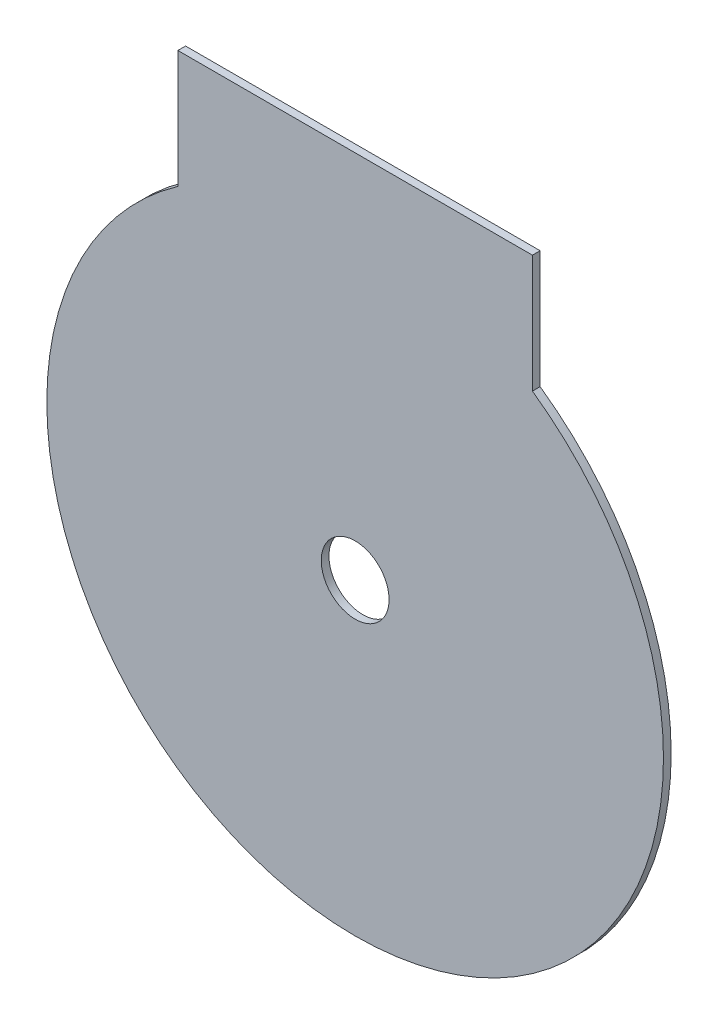
ISO-10303-21;
HEADER;
FILE_DESCRIPTION(('STEP AP214'),'2;1');
FILE_NAME('part.step','',(''),(''),'','','');
FILE_SCHEMA(('AUTOMOTIVE_DESIGN { 1 0 10303 214 1 1 1 1 }'));
ENDSEC;
DATA;
#1=APPLICATION_CONTEXT('core data for automotive mechanical design processes');
#2=APPLICATION_PROTOCOL_DEFINITION('international standard','automotive_design',2000,#1);
#3=PRODUCT_CONTEXT('',#1,'mechanical');
#4=PRODUCT('Part','Part','',(#3));
#5=PRODUCT_RELATED_PRODUCT_CATEGORY('part','',(#4));
#6=PRODUCT_DEFINITION_FORMATION('','',#4);
#7=PRODUCT_DEFINITION_CONTEXT('part definition',#1,'design');
#8=PRODUCT_DEFINITION('design','',#6,#7);
#9=PRODUCT_DEFINITION_SHAPE('','',#8);
#10=(LENGTH_UNIT() NAMED_UNIT(*) SI_UNIT(.MILLI.,.METRE.));
#11=(NAMED_UNIT(*) PLANE_ANGLE_UNIT() SI_UNIT($,.RADIAN.));
#12=(NAMED_UNIT(*) SI_UNIT($,.STERADIAN.) SOLID_ANGLE_UNIT());
#13=UNCERTAINTY_MEASURE_WITH_UNIT(LENGTH_MEASURE(1.E-05),#10,'distance_accuracy_value','');
#14=(GEOMETRIC_REPRESENTATION_CONTEXT(3) GLOBAL_UNCERTAINTY_ASSIGNED_CONTEXT((#13)) GLOBAL_UNIT_ASSIGNED_CONTEXT((#10,
#11,#12)) REPRESENTATION_CONTEXT('',''));
#15=CARTESIAN_POINT('',(0.,0.,0.));
#16=DIRECTION('',(0.,0.,1.));
#17=DIRECTION('',(1.,0.,0.));
#18=AXIS2_PLACEMENT_3D('',#15,#16,#17);
#19=CARTESIAN_POINT('',(0.,129.,2.5));
#20=DIRECTION('',(0.,0.,1.));
#21=DIRECTION('',(1.,0.,0.));
#22=AXIS2_PLACEMENT_3D('',#19,#20,#21);
#23=PLANE('',#22);
#24=DIRECTION('',(-1.,0.,0.));
#25=VECTOR('',#24,1.);
#26=CARTESIAN_POINT('',(57.5,249.,2.5));
#27=LINE('',#26,#25);
#28=CARTESIAN_POINT('',(57.5,249.,2.5));
#29=VERTEX_POINT('',#28);
#30=CARTESIAN_POINT('',(-57.5,249.,2.5));
#31=VERTEX_POINT('',#30);
#32=EDGE_CURVE('E84',#29,#31,#27,.T.);
#33=ORIENTED_EDGE('',*,*,#32,.T.);
#34=DIRECTION('',(0.,-1.,0.));
#35=VECTOR('',#34,1.);
#36=CARTESIAN_POINT('',(-57.5,249.,2.5));
#37=LINE('',#36,#35);
#38=CARTESIAN_POINT('',(-57.5,210.815340859768,2.5));
#39=VERTEX_POINT('',#38);
#40=EDGE_CURVE('E79',#31,#39,#37,.T.);
#41=ORIENTED_EDGE('',*,*,#40,.T.);
#42=CARTESIAN_POINT('',(0.,129.,2.5));
#43=DIRECTION('',(0.,0.,1.));
#44=DIRECTION('',(1.,0.,0.));
#45=AXIS2_PLACEMENT_3D('',#42,#43,#44);
#46=CIRCLE('',#45,100.);
#47=CARTESIAN_POINT('',(57.5,210.815340859768,2.5));
#48=VERTEX_POINT('',#47);
#49=EDGE_CURVE('E82',#39,#48,#46,.T.);
#50=ORIENTED_EDGE('',*,*,#49,.T.);
#51=DIRECTION('',(0.,1.,0.));
#52=VECTOR('',#51,1.);
#53=CARTESIAN_POINT('',(57.5,249.,2.5));
#54=LINE('',#53,#52);
#55=EDGE_CURVE('E49',#48,#29,#54,.T.);
#56=ORIENTED_EDGE('',*,*,#55,.T.);
#57=EDGE_LOOP('',(#33,#41,#50,#56));
#58=FACE_BOUND('',#57,.T.);
#59=CARTESIAN_POINT('',(0.,129.,2.5));
#60=DIRECTION('',(0.,0.,1.));
#61=DIRECTION('',(1.,0.,0.));
#62=AXIS2_PLACEMENT_3D('',#59,#60,#61);
#63=CIRCLE('',#62,11.);
#64=CARTESIAN_POINT('',(11.,129.,2.5));
#65=VERTEX_POINT('',#64);
#66=EDGE_CURVE('E99',#65,#65,#63,.T.);
#67=ORIENTED_EDGE('',*,*,#66,.F.);
#68=EDGE_LOOP('',(#67));
#69=FACE_BOUND('',#68,.T.);
#70=ADVANCED_FACE('F32',(#58,#69),#23,.T.);
#71=CARTESIAN_POINT('',(0.,129.,0.));
#72=DIRECTION('',(0.,0.,1.));
#73=DIRECTION('',(1.,0.,0.));
#74=AXIS2_PLACEMENT_3D('',#71,#72,#73);
#75=PLANE('',#74);
#76=DIRECTION('',(-1.,0.,0.));
#77=VECTOR('',#76,1.);
#78=CARTESIAN_POINT('',(57.5,249.,0.));
#79=LINE('',#78,#77);
#80=CARTESIAN_POINT('',(57.5,249.,0.));
#81=VERTEX_POINT('',#80);
#82=CARTESIAN_POINT('',(-57.5,249.,0.));
#83=VERTEX_POINT('',#82);
#84=EDGE_CURVE('E96',#81,#83,#79,.T.);
#85=ORIENTED_EDGE('',*,*,#84,.F.);
#86=DIRECTION('',(0.,1.,0.));
#87=VECTOR('',#86,1.);
#88=CARTESIAN_POINT('',(57.5,249.,0.));
#89=LINE('',#88,#87);
#90=CARTESIAN_POINT('',(57.5,210.815340859768,0.));
#91=VERTEX_POINT('',#90);
#92=EDGE_CURVE('E72',#91,#81,#89,.T.);
#93=ORIENTED_EDGE('',*,*,#92,.F.);
#94=CARTESIAN_POINT('',(0.,129.,0.));
#95=DIRECTION('',(0.,0.,1.));
#96=DIRECTION('',(1.,0.,0.));
#97=AXIS2_PLACEMENT_3D('',#94,#95,#96);
#98=CIRCLE('',#97,100.);
#99=CARTESIAN_POINT('',(-57.5,210.815340859768,0.));
#100=VERTEX_POINT('',#99);
#101=EDGE_CURVE('E66',#100,#91,#98,.T.);
#102=ORIENTED_EDGE('',*,*,#101,.F.);
#103=DIRECTION('',(0.,-1.,0.));
#104=VECTOR('',#103,1.);
#105=CARTESIAN_POINT('',(-57.5,249.,0.));
#106=LINE('',#105,#104);
#107=EDGE_CURVE('E88',#83,#100,#106,.T.);
#108=ORIENTED_EDGE('',*,*,#107,.F.);
#109=EDGE_LOOP('',(#85,#93,#102,#108));
#110=FACE_BOUND('',#109,.T.);
#111=CARTESIAN_POINT('',(0.,129.,0.));
#112=DIRECTION('',(0.,0.,1.));
#113=DIRECTION('',(1.,0.,0.));
#114=AXIS2_PLACEMENT_3D('',#111,#112,#113);
#115=CIRCLE('',#114,11.);
#116=CARTESIAN_POINT('',(11.,129.,0.));
#117=VERTEX_POINT('',#116);
#118=EDGE_CURVE('E111',#117,#117,#115,.T.);
#119=ORIENTED_EDGE('',*,*,#118,.T.);
#120=EDGE_LOOP('',(#119));
#121=FACE_BOUND('',#120,.T.);
#122=ADVANCED_FACE('F107',(#110,#121),#75,.F.);
#123=CARTESIAN_POINT('',(57.5,249.,2.5));
#124=DIRECTION('',(0.,-1.,0.));
#125=DIRECTION('',(0.,0.,-1.));
#126=AXIS2_PLACEMENT_3D('',#123,#124,#125);
#127=PLANE('',#126);
#128=ORIENTED_EDGE('',*,*,#84,.T.);
#129=DIRECTION('',(0.,0.,-1.));
#130=VECTOR('',#129,1.);
#131=CARTESIAN_POINT('',(-57.5,249.,2.5));
#132=LINE('',#131,#130);
#133=EDGE_CURVE('E11',#31,#83,#132,.T.);
#134=ORIENTED_EDGE('',*,*,#133,.F.);
#135=ORIENTED_EDGE('',*,*,#32,.F.);
#136=DIRECTION('',(0.,0.,-1.));
#137=VECTOR('',#136,1.);
#138=CARTESIAN_POINT('',(57.5,249.,2.5));
#139=LINE('',#138,#137);
#140=EDGE_CURVE('E92',#29,#81,#139,.T.);
#141=ORIENTED_EDGE('',*,*,#140,.T.);
#142=EDGE_LOOP('',(#128,#134,#135,#141));
#143=FACE_BOUND('',#142,.T.);
#144=ADVANCED_FACE('F34',(#143),#127,.F.);
#145=CARTESIAN_POINT('',(-57.5,249.,2.5));
#146=DIRECTION('',(1.,0.,0.));
#147=DIRECTION('',(0.,0.,-1.));
#148=AXIS2_PLACEMENT_3D('',#145,#146,#147);
#149=PLANE('',#148);
#150=ORIENTED_EDGE('',*,*,#107,.T.);
#151=DIRECTION('',(0.,0.,-1.));
#152=VECTOR('',#151,1.);
#153=CARTESIAN_POINT('',(-57.5,210.815340859768,2.5));
#154=LINE('',#153,#152);
#155=EDGE_CURVE('E41',#39,#100,#154,.T.);
#156=ORIENTED_EDGE('',*,*,#155,.F.);
#157=ORIENTED_EDGE('',*,*,#40,.F.);
#158=ORIENTED_EDGE('',*,*,#133,.T.);
#159=EDGE_LOOP('',(#150,#156,#157,#158));
#160=FACE_BOUND('',#159,.T.);
#161=ADVANCED_FACE('F87',(#160),#149,.F.);
#162=CARTESIAN_POINT('',(0.,129.,2.5));
#163=DIRECTION('',(0.,0.,-1.));
#164=DIRECTION('',(-1.,0.,0.));
#165=AXIS2_PLACEMENT_3D('',#162,#163,#164);
#166=CYLINDRICAL_SURFACE('',#165,100.);
#167=ORIENTED_EDGE('',*,*,#101,.T.);
#168=DIRECTION('',(0.,0.,-1.));
#169=VECTOR('',#168,1.);
#170=CARTESIAN_POINT('',(57.5,210.815340859768,2.5));
#171=LINE('',#170,#169);
#172=EDGE_CURVE('E89',#48,#91,#171,.T.);
#173=ORIENTED_EDGE('',*,*,#172,.F.);
#174=ORIENTED_EDGE('',*,*,#49,.F.);
#175=ORIENTED_EDGE('',*,*,#155,.T.);
#176=EDGE_LOOP('',(#167,#173,#174,#175));
#177=FACE_BOUND('',#176,.T.);
#178=ADVANCED_FACE('F90',(#177),#166,.T.);
#179=CARTESIAN_POINT('',(57.5,249.,2.5));
#180=DIRECTION('',(-1.,0.,0.));
#181=DIRECTION('',(0.,0.,1.));
#182=AXIS2_PLACEMENT_3D('',#179,#180,#181);
#183=PLANE('',#182);
#184=ORIENTED_EDGE('',*,*,#92,.T.);
#185=ORIENTED_EDGE('',*,*,#140,.F.);
#186=ORIENTED_EDGE('',*,*,#55,.F.);
#187=ORIENTED_EDGE('',*,*,#172,.T.);
#188=EDGE_LOOP('',(#184,#185,#186,#187));
#189=FACE_BOUND('',#188,.T.);
#190=ADVANCED_FACE('F104',(#189),#183,.F.);
#191=CARTESIAN_POINT('',(0.,129.,2.5));
#192=DIRECTION('',(0.,0.,-1.));
#193=DIRECTION('',(-1.,0.,0.));
#194=AXIS2_PLACEMENT_3D('',#191,#192,#193);
#195=CYLINDRICAL_SURFACE('',#194,11.);
#196=ORIENTED_EDGE('',*,*,#66,.T.);
#197=EDGE_LOOP('',(#196));
#198=FACE_BOUND('',#197,.T.);
#199=ORIENTED_EDGE('',*,*,#118,.F.);
#200=EDGE_LOOP('',(#199));
#201=FACE_BOUND('',#200,.T.);
#202=ADVANCED_FACE('F117',(#198,#201),#195,.F.);
#203=CLOSED_SHELL('',(#70,#122,#144,#161,#178,#190,#202));
#204=MANIFOLD_SOLID_BREP('B2',#203);
#205=ADVANCED_BREP_SHAPE_REPRESENTATION('',(#18,#204),#14);
#206=SHAPE_DEFINITION_REPRESENTATION(#9,#205);
ENDSEC;
END-ISO-10303-21;
